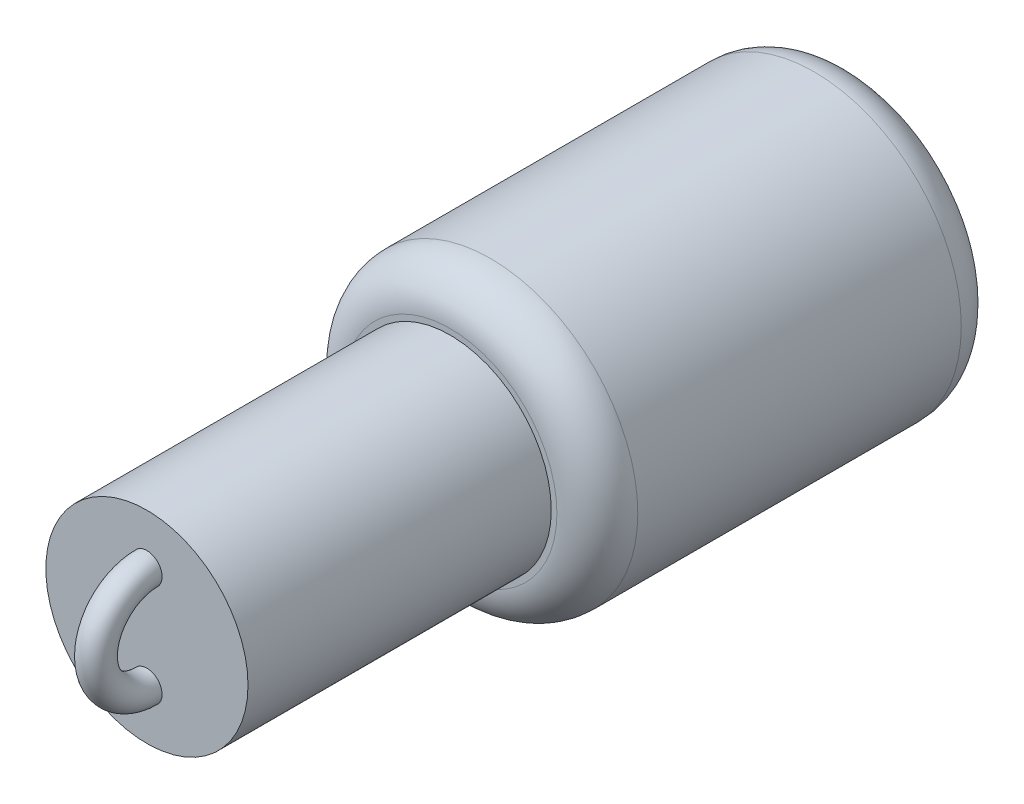
ISO-10303-21;
HEADER;
FILE_DESCRIPTION(('STEP AP214'),'2;1');
FILE_NAME('part.step','',(''),(''),'','','');
FILE_SCHEMA(('AUTOMOTIVE_DESIGN { 1 0 10303 214 1 1 1 1 }'));
ENDSEC;
DATA;
#1=APPLICATION_CONTEXT('core data for automotive mechanical design processes');
#2=APPLICATION_PROTOCOL_DEFINITION('international standard','automotive_design',2000,#1);
#3=PRODUCT_CONTEXT('',#1,'mechanical');
#4=PRODUCT('Part','Part','',(#3));
#5=PRODUCT_RELATED_PRODUCT_CATEGORY('part','',(#4));
#6=PRODUCT_DEFINITION_FORMATION('','',#4);
#7=PRODUCT_DEFINITION_CONTEXT('part definition',#1,'design');
#8=PRODUCT_DEFINITION('design','',#6,#7);
#9=PRODUCT_DEFINITION_SHAPE('','',#8);
#10=(LENGTH_UNIT() NAMED_UNIT(*) SI_UNIT(.MILLI.,.METRE.));
#11=(NAMED_UNIT(*) PLANE_ANGLE_UNIT() SI_UNIT($,.RADIAN.));
#12=(NAMED_UNIT(*) SI_UNIT($,.STERADIAN.) SOLID_ANGLE_UNIT());
#13=UNCERTAINTY_MEASURE_WITH_UNIT(LENGTH_MEASURE(1.E-05),#10,'distance_accuracy_value','');
#14=(GEOMETRIC_REPRESENTATION_CONTEXT(3) GLOBAL_UNCERTAINTY_ASSIGNED_CONTEXT((#13)) GLOBAL_UNIT_ASSIGNED_CONTEXT((#10,
#11,#12)) REPRESENTATION_CONTEXT('',''));
#15=CARTESIAN_POINT('',(0.,0.,0.));
#16=DIRECTION('',(0.,0.,1.));
#17=DIRECTION('',(1.,0.,0.));
#18=AXIS2_PLACEMENT_3D('',#15,#16,#17);
#19=CARTESIAN_POINT('',(0.,0.,20.));
#20=DIRECTION('',(0.,0.,-1.));
#21=DIRECTION('',(-1.,0.,0.));
#22=AXIS2_PLACEMENT_3D('',#19,#20,#21);
#23=CYLINDRICAL_SURFACE('',#22,7.28);
#24=CARTESIAN_POINT('',(0.,0.,18.));
#25=DIRECTION('',(0.,0.,1.));
#26=DIRECTION('',(1.,0.,0.));
#27=AXIS2_PLACEMENT_3D('',#24,#25,#26);
#28=CIRCLE('',#27,7.28);
#29=CARTESIAN_POINT('',(7.28,0.,18.));
#30=VERTEX_POINT('',#29);
#31=EDGE_CURVE('E39',#30,#30,#28,.F.);
#32=ORIENTED_EDGE('',*,*,#31,.T.);
#33=EDGE_LOOP('',(#32));
#34=FACE_BOUND('',#33,.T.);
#35=CARTESIAN_POINT('',(0.,0.,2.));
#36=DIRECTION('',(0.,0.,1.));
#37=DIRECTION('',(1.,0.,0.));
#38=AXIS2_PLACEMENT_3D('',#35,#36,#37);
#39=CIRCLE('',#38,7.28);
#40=CARTESIAN_POINT('',(7.28,0.,2.));
#41=VERTEX_POINT('',#40);
#42=EDGE_CURVE('E43',#41,#41,#39,.T.);
#43=ORIENTED_EDGE('',*,*,#42,.T.);
#44=EDGE_LOOP('',(#43));
#45=FACE_BOUND('',#44,.T.);
#46=ADVANCED_FACE('F31',(#34,#45),#23,.T.);
#47=CARTESIAN_POINT('',(0.,0.,20.));
#48=DIRECTION('',(0.,0.,1.));
#49=DIRECTION('',(1.,0.,0.));
#50=AXIS2_PLACEMENT_3D('',#47,#48,#49);
#51=PLANE('',#50);
#52=CARTESIAN_POINT('',(0.,0.,20.));
#53=DIRECTION('',(0.,0.,1.));
#54=DIRECTION('',(1.,0.,0.));
#55=AXIS2_PLACEMENT_3D('',#52,#53,#54);
#56=CIRCLE('',#55,5.);
#57=CARTESIAN_POINT('',(5.,0.,20.));
#58=VERTEX_POINT('',#57);
#59=EDGE_CURVE('E52',#58,#58,#56,.T.);
#60=ORIENTED_EDGE('',*,*,#59,.F.);
#61=EDGE_LOOP('',(#60));
#62=FACE_BOUND('',#61,.T.);
#63=CARTESIAN_POINT('',(0.,0.,20.));
#64=DIRECTION('',(0.,0.,1.));
#65=DIRECTION('',(1.,0.,0.));
#66=AXIS2_PLACEMENT_3D('',#63,#64,#65);
#67=CIRCLE('',#66,5.28);
#68=CARTESIAN_POINT('',(5.28,0.,20.));
#69=VERTEX_POINT('',#68);
#70=EDGE_CURVE('E48',#69,#69,#67,.T.);
#71=ORIENTED_EDGE('',*,*,#70,.T.);
#72=EDGE_LOOP('',(#71));
#73=FACE_BOUND('',#72,.T.);
#74=ADVANCED_FACE('F77',(#62,#73),#51,.T.);
#75=CARTESIAN_POINT('',(0.,0.,0.));
#76=DIRECTION('',(0.,0.,1.));
#77=DIRECTION('',(1.,0.,0.));
#78=AXIS2_PLACEMENT_3D('',#75,#76,#77);
#79=PLANE('',#78);
#80=CARTESIAN_POINT('',(0.,0.,0.));
#81=DIRECTION('',(0.,0.,1.));
#82=DIRECTION('',(1.,0.,0.));
#83=AXIS2_PLACEMENT_3D('',#80,#81,#82);
#84=CIRCLE('',#83,5.28);
#85=CARTESIAN_POINT('',(5.28,0.,0.));
#86=VERTEX_POINT('',#85);
#87=EDGE_CURVE('E10',#86,#86,#84,.F.);
#88=ORIENTED_EDGE('',*,*,#87,.T.);
#89=EDGE_LOOP('',(#88));
#90=FACE_BOUND('',#89,.T.);
#91=ADVANCED_FACE('F84',(#90),#79,.F.);
#92=CARTESIAN_POINT('',(0.,0.,18.));
#93=DIRECTION('',(0.,0.,1.));
#94=DIRECTION('',(1.,0.,0.));
#95=AXIS2_PLACEMENT_3D('',#92,#93,#94);
#96=TOROIDAL_SURFACE('',#95,5.28,2.);
#97=ORIENTED_EDGE('',*,*,#31,.F.);
#98=EDGE_LOOP('',(#97));
#99=FACE_BOUND('',#98,.T.);
#100=ORIENTED_EDGE('',*,*,#70,.F.);
#101=EDGE_LOOP('',(#100));
#102=FACE_BOUND('',#101,.T.);
#103=ADVANCED_FACE('F89',(#99,#102),#96,.T.);
#104=CARTESIAN_POINT('',(0.,0.,2.));
#105=DIRECTION('',(0.,0.,1.));
#106=DIRECTION('',(1.,0.,0.));
#107=AXIS2_PLACEMENT_3D('',#104,#105,#106);
#108=TOROIDAL_SURFACE('',#107,5.28,2.);
#109=ORIENTED_EDGE('',*,*,#87,.F.);
#110=EDGE_LOOP('',(#109));
#111=FACE_BOUND('',#110,.T.);
#112=ORIENTED_EDGE('',*,*,#42,.F.);
#113=EDGE_LOOP('',(#112));
#114=FACE_BOUND('',#113,.T.);
#115=ADVANCED_FACE('F33',(#111,#114),#108,.T.);
#116=CARTESIAN_POINT('',(0.,0.,35.));
#117=DIRECTION('',(0.,0.,-1.));
#118=DIRECTION('',(-1.,0.,0.));
#119=AXIS2_PLACEMENT_3D('',#116,#117,#118);
#120=CYLINDRICAL_SURFACE('',#119,5.);
#121=CARTESIAN_POINT('',(0.,0.,35.));
#122=DIRECTION('',(0.,0.,1.));
#123=DIRECTION('',(1.,0.,0.));
#124=AXIS2_PLACEMENT_3D('',#121,#122,#123);
#125=CIRCLE('',#124,5.);
#126=CARTESIAN_POINT('',(5.,0.,35.));
#127=VERTEX_POINT('',#126);
#128=EDGE_CURVE('E51',#127,#127,#125,.T.);
#129=ORIENTED_EDGE('',*,*,#128,.F.);
#130=EDGE_LOOP('',(#129));
#131=FACE_BOUND('',#130,.T.);
#132=ORIENTED_EDGE('',*,*,#59,.T.);
#133=EDGE_LOOP('',(#132));
#134=FACE_BOUND('',#133,.T.);
#135=ADVANCED_FACE('F73',(#131,#134),#120,.T.);
#136=CARTESIAN_POINT('',(0.,0.,35.));
#137=DIRECTION('',(0.,0.,1.));
#138=DIRECTION('',(1.,0.,0.));
#139=AXIS2_PLACEMENT_3D('',#136,#137,#138);
#140=PLANE('',#139);
#141=CARTESIAN_POINT('',(0.,2.51953533741256,35.));
#142=DIRECTION('',(0.,0.,1.));
#143=DIRECTION('',(1.,0.,0.));
#144=AXIS2_PLACEMENT_3D('',#141,#142,#143);
#145=CIRCLE('',#144,0.75);
#146=CARTESIAN_POINT('',(0.,3.26953533741256,35.));
#147=VERTEX_POINT('',#146);
#148=EDGE_CURVE('E57',#147,#147,#145,.T.);
#149=ORIENTED_EDGE('',*,*,#148,.F.);
#150=EDGE_LOOP('',(#149));
#151=FACE_BOUND('',#150,.T.);
#152=CARTESIAN_POINT('',(0.,-2.51953533741256,35.));
#153=DIRECTION('',(0.,0.,1.));
#154=DIRECTION('',(1.,0.,0.));
#155=AXIS2_PLACEMENT_3D('',#152,#153,#154);
#156=CIRCLE('',#155,0.75);
#157=CARTESIAN_POINT('',(0.,-3.26953533741256,35.));
#158=VERTEX_POINT('',#157);
#159=EDGE_CURVE('E35',#158,#158,#156,.F.);
#160=ORIENTED_EDGE('',*,*,#159,.T.);
#161=EDGE_LOOP('',(#160));
#162=FACE_BOUND('',#161,.T.);
#163=ORIENTED_EDGE('',*,*,#128,.T.);
#164=EDGE_LOOP('',(#163));
#165=FACE_BOUND('',#164,.T.);
#166=ADVANCED_FACE('F64',(#151,#162,#165),#140,.T.);
#167=CARTESIAN_POINT('',(0.,0.,35.));
#168=DIRECTION('',(-1.,0.,0.));
#169=DIRECTION('',(0.,0.,1.));
#170=AXIS2_PLACEMENT_3D('',#167,#168,#169);
#171=TOROIDAL_SURFACE('',#170,2.51953533741256,0.75);
#172=CARTESIAN_POINT('',(0.,0.,35.));
#173=DIRECTION('',(-1.,0.,0.));
#174=DIRECTION('',(0.,0.,1.));
#175=AXIS2_PLACEMENT_3D('',#172,#173,#174);
#176=CIRCLE('',#175,3.26953533741256);
#177=EDGE_CURVE('',#158,#147,#176,.T.);
#178=ORIENTED_EDGE('',*,*,#159,.F.);
#179=ORIENTED_EDGE('',*,*,#148,.T.);
#180=ORIENTED_EDGE('',*,*,#177,.T.);
#181=ORIENTED_EDGE('',*,*,#177,.F.);
#182=EDGE_LOOP('',(#178,#180,#179,#181));
#183=FACE_BOUND('',#182,.T.);
#184=ADVANCED_FACE('F67',(#183),#171,.T.);
#185=CLOSED_SHELL('',(#46,#74,#91,#103,#115,#135,#166,#184));
#186=MANIFOLD_SOLID_BREP('B2',#185);
#187=ADVANCED_BREP_SHAPE_REPRESENTATION('',(#18,#186),#14);
#188=SHAPE_DEFINITION_REPRESENTATION(#9,#187);
ENDSEC;
END-ISO-10303-21;
